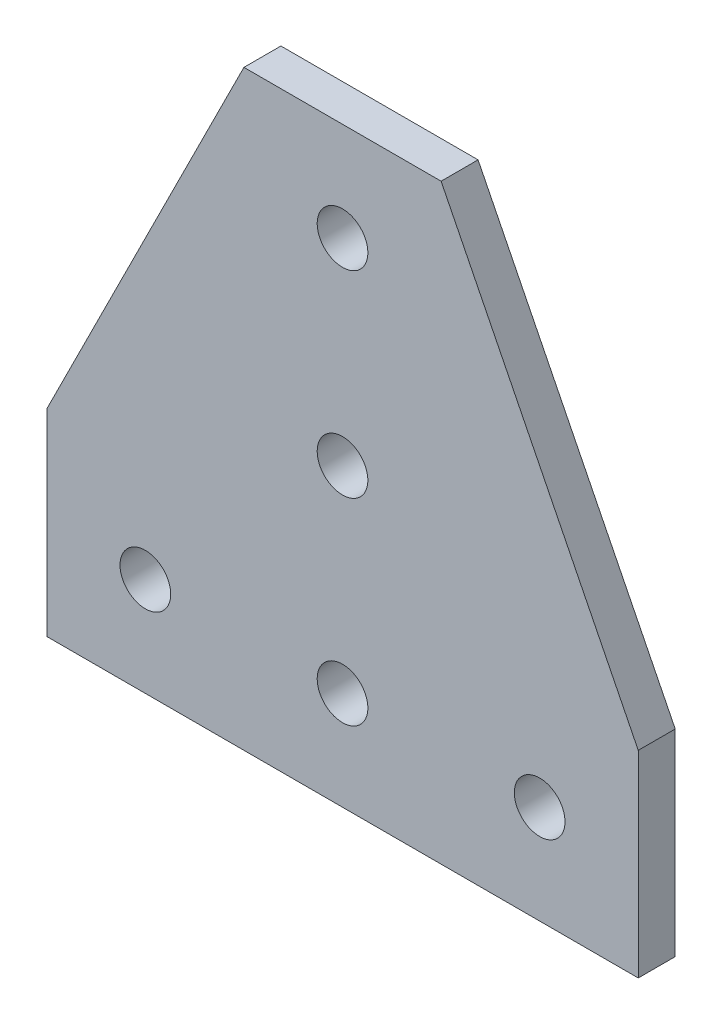
ISO-10303-21;
HEADER;
FILE_DESCRIPTION(('STEP AP214'),'2;1');
FILE_NAME('part.step','',(''),(''),'','','');
FILE_SCHEMA(('AUTOMOTIVE_DESIGN { 1 0 10303 214 1 1 1 1 }'));
ENDSEC;
DATA;
#1=APPLICATION_CONTEXT('core data for automotive mechanical design processes');
#2=APPLICATION_PROTOCOL_DEFINITION('international standard','automotive_design',2000,#1);
#3=PRODUCT_CONTEXT('',#1,'mechanical');
#4=PRODUCT('Part','Part','',(#3));
#5=PRODUCT_RELATED_PRODUCT_CATEGORY('part','',(#4));
#6=PRODUCT_DEFINITION_FORMATION('','',#4);
#7=PRODUCT_DEFINITION_CONTEXT('part definition',#1,'design');
#8=PRODUCT_DEFINITION('design','',#6,#7);
#9=PRODUCT_DEFINITION_SHAPE('','',#8);
#10=(LENGTH_UNIT() NAMED_UNIT(*) SI_UNIT(.MILLI.,.METRE.));
#11=(NAMED_UNIT(*) PLANE_ANGLE_UNIT() SI_UNIT($,.RADIAN.));
#12=(NAMED_UNIT(*) SI_UNIT($,.STERADIAN.) SOLID_ANGLE_UNIT());
#13=UNCERTAINTY_MEASURE_WITH_UNIT(LENGTH_MEASURE(1.E-05),#10,'distance_accuracy_value','');
#14=(GEOMETRIC_REPRESENTATION_CONTEXT(3) GLOBAL_UNCERTAINTY_ASSIGNED_CONTEXT((#13)) GLOBAL_UNIT_ASSIGNED_CONTEXT((#10,
#11,#12)) REPRESENTATION_CONTEXT('',''));
#15=CARTESIAN_POINT('',(0.,0.,0.));
#16=DIRECTION('',(0.,0.,1.));
#17=DIRECTION('',(1.,0.,0.));
#18=AXIS2_PLACEMENT_3D('',#15,#16,#17);
#19=CARTESIAN_POINT('',(-12.6999999999999,-25.4,-4.7625));
#20=DIRECTION('',(-0.894427190999916,0.447213595499959,0.));
#21=DIRECTION('',(-0.447213595499958,-0.894427190999918,0.));
#22=AXIS2_PLACEMENT_3D('',#19,#20,#21);
#23=PLANE('',#22);
#24=DIRECTION('',(-0.447213595499958,-0.894427190999918,0.));
#25=VECTOR('',#24,1.);
#26=CARTESIAN_POINT('',(-12.6999999999999,-25.4,0.));
#27=LINE('',#26,#25);
#28=CARTESIAN_POINT('',(12.7,25.4,0.));
#29=VERTEX_POINT('',#28);
#30=CARTESIAN_POINT('',(-12.6999999999999,-25.4,0.));
#31=VERTEX_POINT('',#30);
#32=EDGE_CURVE('E130',#29,#31,#27,.T.);
#33=ORIENTED_EDGE('',*,*,#32,.F.);
#34=DIRECTION('',(0.,0.,1.));
#35=VECTOR('',#34,1.);
#36=CARTESIAN_POINT('',(12.7,25.4,-4.7625));
#37=LINE('',#36,#35);
#38=CARTESIAN_POINT('',(12.7,25.4,-4.7625));
#39=VERTEX_POINT('',#38);
#40=EDGE_CURVE('E11',#39,#29,#37,.T.);
#41=ORIENTED_EDGE('',*,*,#40,.F.);
#42=DIRECTION('',(-0.447213595499958,-0.894427190999918,0.));
#43=VECTOR('',#42,1.);
#44=CARTESIAN_POINT('',(-12.6999999999999,-25.4,-4.7625));
#45=LINE('',#44,#43);
#46=CARTESIAN_POINT('',(-12.6999999999999,-25.4,-4.7625));
#47=VERTEX_POINT('',#46);
#48=EDGE_CURVE('E122',#39,#47,#45,.T.);
#49=ORIENTED_EDGE('',*,*,#48,.T.);
#50=DIRECTION('',(0.,0.,1.));
#51=VECTOR('',#50,1.);
#52=CARTESIAN_POINT('',(-12.6999999999999,-25.4,-4.7625));
#53=LINE('',#52,#51);
#54=EDGE_CURVE('E39',#47,#31,#53,.T.);
#55=ORIENTED_EDGE('',*,*,#54,.T.);
#56=EDGE_LOOP('',(#33,#41,#49,#55));
#57=FACE_BOUND('',#56,.T.);
#58=ADVANCED_FACE('F36',(#57),#23,.T.);
#59=CARTESIAN_POINT('',(12.7,25.4,-4.7625));
#60=DIRECTION('',(0.,1.,0.));
#61=DIRECTION('',(0.,0.,1.));
#62=AXIS2_PLACEMENT_3D('',#59,#60,#61);
#63=PLANE('',#62);
#64=DIRECTION('',(-1.,0.,0.));
#65=VECTOR('',#64,1.);
#66=CARTESIAN_POINT('',(12.7,25.4,0.));
#67=LINE('',#66,#65);
#68=CARTESIAN_POINT('',(38.1000000000001,25.4,0.));
#69=VERTEX_POINT('',#68);
#70=EDGE_CURVE('E125',#69,#29,#67,.T.);
#71=ORIENTED_EDGE('',*,*,#70,.F.);
#72=DIRECTION('',(0.,0.,1.));
#73=VECTOR('',#72,1.);
#74=CARTESIAN_POINT('',(38.1000000000001,25.4,-4.7625));
#75=LINE('',#74,#73);
#76=CARTESIAN_POINT('',(38.1000000000001,25.4,-4.7625));
#77=VERTEX_POINT('',#76);
#78=EDGE_CURVE('E118',#77,#69,#75,.T.);
#79=ORIENTED_EDGE('',*,*,#78,.F.);
#80=DIRECTION('',(-1.,0.,0.));
#81=VECTOR('',#80,1.);
#82=CARTESIAN_POINT('',(12.7,25.4,-4.7625));
#83=LINE('',#82,#81);
#84=EDGE_CURVE('E108',#77,#39,#83,.T.);
#85=ORIENTED_EDGE('',*,*,#84,.T.);
#86=ORIENTED_EDGE('',*,*,#40,.T.);
#87=EDGE_LOOP('',(#71,#79,#85,#86));
#88=FACE_BOUND('',#87,.T.);
#89=ADVANCED_FACE('F142',(#88),#63,.T.);
#90=CARTESIAN_POINT('',(25.4,-50.8000000000001,-4.7625));
#91=DIRECTION('',(0.,-1.,0.));
#92=DIRECTION('',(1.,0.,0.));
#93=AXIS2_PLACEMENT_3D('',#90,#91,#92);
#94=PLANE('',#93);
#95=DIRECTION('',(1.,0.,0.));
#96=VECTOR('',#95,1.);
#97=CARTESIAN_POINT('',(25.4,-50.8000000000001,0.));
#98=LINE('',#97,#96);
#99=CARTESIAN_POINT('',(-12.7,-50.8000000000001,0.));
#100=VERTEX_POINT('',#99);
#101=CARTESIAN_POINT('',(63.5,-50.8000000000001,0.));
#102=VERTEX_POINT('',#101);
#103=EDGE_CURVE('E136',#100,#102,#98,.T.);
#104=ORIENTED_EDGE('',*,*,#103,.F.);
#105=DIRECTION('',(0.,0.,1.));
#106=VECTOR('',#105,1.);
#107=CARTESIAN_POINT('',(-12.7,-50.8000000000001,-4.7625));
#108=LINE('',#107,#106);
#109=CARTESIAN_POINT('',(-12.7,-50.8000000000001,-4.7625));
#110=VERTEX_POINT('',#109);
#111=EDGE_CURVE('E45',#110,#100,#108,.T.);
#112=ORIENTED_EDGE('',*,*,#111,.F.);
#113=DIRECTION('',(1.,0.,0.));
#114=VECTOR('',#113,1.);
#115=CARTESIAN_POINT('',(25.4,-50.8000000000001,-4.7625));
#116=LINE('',#115,#114);
#117=CARTESIAN_POINT('',(63.5,-50.8000000000001,-4.7625));
#118=VERTEX_POINT('',#117);
#119=EDGE_CURVE('E127',#110,#118,#116,.T.);
#120=ORIENTED_EDGE('',*,*,#119,.T.);
#121=DIRECTION('',(0.,0.,1.));
#122=VECTOR('',#121,1.);
#123=CARTESIAN_POINT('',(63.5,-50.8000000000001,-4.7625));
#124=LINE('',#123,#122);
#125=EDGE_CURVE('E101',#118,#102,#124,.T.);
#126=ORIENTED_EDGE('',*,*,#125,.T.);
#127=EDGE_LOOP('',(#104,#112,#120,#126));
#128=FACE_BOUND('',#127,.T.);
#129=ADVANCED_FACE('F215',(#128),#94,.T.);
#130=CARTESIAN_POINT('',(-12.7,-50.8000000000001,-4.7625));
#131=DIRECTION('',(-1.,0.,0.));
#132=DIRECTION('',(0.,0.,1.));
#133=AXIS2_PLACEMENT_3D('',#130,#131,#132);
#134=PLANE('',#133);
#135=DIRECTION('',(0.,-1.,0.));
#136=VECTOR('',#135,1.);
#137=CARTESIAN_POINT('',(-12.7,-50.8000000000001,0.));
#138=LINE('',#137,#136);
#139=EDGE_CURVE('E133',#31,#100,#138,.T.);
#140=ORIENTED_EDGE('',*,*,#139,.F.);
#141=ORIENTED_EDGE('',*,*,#54,.F.);
#142=DIRECTION('',(0.,-1.,0.));
#143=VECTOR('',#142,1.);
#144=CARTESIAN_POINT('',(-12.7,-50.8000000000001,-4.7625));
#145=LINE('',#144,#143);
#146=EDGE_CURVE('E124',#47,#110,#145,.T.);
#147=ORIENTED_EDGE('',*,*,#146,.T.);
#148=ORIENTED_EDGE('',*,*,#111,.T.);
#149=EDGE_LOOP('',(#140,#141,#147,#148));
#150=FACE_BOUND('',#149,.T.);
#151=ADVANCED_FACE('F139',(#150),#134,.T.);
#152=CARTESIAN_POINT('',(12.7,25.4,-4.7625));
#153=DIRECTION('',(0.,0.,-1.));
#154=DIRECTION('',(-1.,0.,0.));
#155=AXIS2_PLACEMENT_3D('',#152,#153,#154);
#156=PLANE('',#155);
#157=CARTESIAN_POINT('',(0.,-38.1,-4.7625));
#158=DIRECTION('',(0.,0.,-1.));
#159=DIRECTION('',(-1.,0.,0.));
#160=AXIS2_PLACEMENT_3D('',#157,#158,#159);
#161=CIRCLE('',#160,3.2639);
#162=CARTESIAN_POINT('',(-3.2639,-38.1,-4.7625));
#163=VERTEX_POINT('',#162);
#164=EDGE_CURVE('E171',#163,#163,#161,.T.);
#165=ORIENTED_EDGE('',*,*,#164,.F.);
#166=EDGE_LOOP('',(#165));
#167=FACE_BOUND('',#166,.T.);
#168=CARTESIAN_POINT('',(50.8000000000001,-38.1,-4.7625));
#169=DIRECTION('',(0.,0.,-1.));
#170=DIRECTION('',(-1.,0.,0.));
#171=AXIS2_PLACEMENT_3D('',#168,#169,#170);
#172=CIRCLE('',#171,3.2639);
#173=CARTESIAN_POINT('',(47.5361000000001,-38.1,-4.7625));
#174=VERTEX_POINT('',#173);
#175=EDGE_CURVE('E165',#174,#174,#172,.T.);
#176=ORIENTED_EDGE('',*,*,#175,.F.);
#177=EDGE_LOOP('',(#176));
#178=FACE_BOUND('',#177,.T.);
#179=CARTESIAN_POINT('',(25.4000000000001,12.6999999999999,-4.7625));
#180=DIRECTION('',(0.,0.,-1.));
#181=DIRECTION('',(-1.,0.,0.));
#182=AXIS2_PLACEMENT_3D('',#179,#180,#181);
#183=CIRCLE('',#182,3.2639);
#184=CARTESIAN_POINT('',(22.1361000000001,12.6999999999999,-4.7625));
#185=VERTEX_POINT('',#184);
#186=EDGE_CURVE('E159',#185,#185,#183,.T.);
#187=ORIENTED_EDGE('',*,*,#186,.F.);
#188=EDGE_LOOP('',(#187));
#189=FACE_BOUND('',#188,.T.);
#190=CARTESIAN_POINT('',(25.4,-12.7,-4.7625));
#191=DIRECTION('',(0.,0.,-1.));
#192=DIRECTION('',(-1.,0.,0.));
#193=AXIS2_PLACEMENT_3D('',#190,#191,#192);
#194=CIRCLE('',#193,3.2639);
#195=CARTESIAN_POINT('',(22.1361,-12.7,-4.7625));
#196=VERTEX_POINT('',#195);
#197=EDGE_CURVE('E153',#196,#196,#194,.T.);
#198=ORIENTED_EDGE('',*,*,#197,.F.);
#199=EDGE_LOOP('',(#198));
#200=FACE_BOUND('',#199,.T.);
#201=CARTESIAN_POINT('',(25.4,-38.1,-4.7625));
#202=DIRECTION('',(0.,0.,-1.));
#203=DIRECTION('',(-1.,0.,0.));
#204=AXIS2_PLACEMENT_3D('',#201,#202,#203);
#205=CIRCLE('',#204,3.2639);
#206=CARTESIAN_POINT('',(22.1361,-38.1,-4.7625));
#207=VERTEX_POINT('',#206);
#208=EDGE_CURVE('E147',#207,#207,#205,.T.);
#209=ORIENTED_EDGE('',*,*,#208,.F.);
#210=EDGE_LOOP('',(#209));
#211=FACE_BOUND('',#210,.T.);
#212=ORIENTED_EDGE('',*,*,#48,.F.);
#213=ORIENTED_EDGE('',*,*,#84,.F.);
#214=DIRECTION('',(0.447213595499958,-0.894427190999918,0.));
#215=VECTOR('',#214,1.);
#216=CARTESIAN_POINT('',(63.5,-25.4000000000001,-4.7625));
#217=LINE('',#216,#215);
#218=CARTESIAN_POINT('',(63.5,-25.4000000000001,-4.7625));
#219=VERTEX_POINT('',#218);
#220=EDGE_CURVE('E104',#77,#219,#217,.T.);
#221=ORIENTED_EDGE('',*,*,#220,.T.);
#222=DIRECTION('',(0.,-1.,0.));
#223=VECTOR('',#222,1.);
#224=CARTESIAN_POINT('',(63.5,-50.8000000000001,-4.7625));
#225=LINE('',#224,#223);
#226=EDGE_CURVE('E93',#219,#118,#225,.T.);
#227=ORIENTED_EDGE('',*,*,#226,.T.);
#228=ORIENTED_EDGE('',*,*,#119,.F.);
#229=ORIENTED_EDGE('',*,*,#146,.F.);
#230=EDGE_LOOP('',(#212,#213,#221,#227,#228,#229));
#231=FACE_BOUND('',#230,.T.);
#232=ADVANCED_FACE('F107',(#167,#178,#189,#200,#211,#231),#156,.T.);
#233=CARTESIAN_POINT('',(12.7,25.4,0.));
#234=DIRECTION('',(0.,0.,-1.));
#235=DIRECTION('',(-1.,0.,0.));
#236=AXIS2_PLACEMENT_3D('',#233,#234,#235);
#237=PLANE('',#236);
#238=CARTESIAN_POINT('',(0.,-38.1,0.));
#239=DIRECTION('',(0.,0.,-1.));
#240=DIRECTION('',(-1.,0.,0.));
#241=AXIS2_PLACEMENT_3D('',#238,#239,#240);
#242=CIRCLE('',#241,3.2639);
#243=CARTESIAN_POINT('',(-3.2639,-38.1,0.));
#244=VERTEX_POINT('',#243);
#245=EDGE_CURVE('E168',#244,#244,#242,.T.);
#246=ORIENTED_EDGE('',*,*,#245,.T.);
#247=EDGE_LOOP('',(#246));
#248=FACE_BOUND('',#247,.T.);
#249=CARTESIAN_POINT('',(50.8000000000001,-38.1,0.));
#250=DIRECTION('',(0.,0.,-1.));
#251=DIRECTION('',(-1.,0.,0.));
#252=AXIS2_PLACEMENT_3D('',#249,#250,#251);
#253=CIRCLE('',#252,3.2639);
#254=CARTESIAN_POINT('',(47.5361000000001,-38.1,0.));
#255=VERTEX_POINT('',#254);
#256=EDGE_CURVE('E162',#255,#255,#253,.T.);
#257=ORIENTED_EDGE('',*,*,#256,.T.);
#258=EDGE_LOOP('',(#257));
#259=FACE_BOUND('',#258,.T.);
#260=CARTESIAN_POINT('',(25.4000000000001,12.6999999999999,0.));
#261=DIRECTION('',(0.,0.,-1.));
#262=DIRECTION('',(-1.,0.,0.));
#263=AXIS2_PLACEMENT_3D('',#260,#261,#262);
#264=CIRCLE('',#263,3.2639);
#265=CARTESIAN_POINT('',(22.1361000000001,12.6999999999999,0.));
#266=VERTEX_POINT('',#265);
#267=EDGE_CURVE('E156',#266,#266,#264,.T.);
#268=ORIENTED_EDGE('',*,*,#267,.T.);
#269=EDGE_LOOP('',(#268));
#270=FACE_BOUND('',#269,.T.);
#271=CARTESIAN_POINT('',(25.4,-12.7,0.));
#272=DIRECTION('',(0.,0.,-1.));
#273=DIRECTION('',(-1.,0.,0.));
#274=AXIS2_PLACEMENT_3D('',#271,#272,#273);
#275=CIRCLE('',#274,3.2639);
#276=CARTESIAN_POINT('',(22.1361,-12.7,0.));
#277=VERTEX_POINT('',#276);
#278=EDGE_CURVE('E150',#277,#277,#275,.T.);
#279=ORIENTED_EDGE('',*,*,#278,.T.);
#280=EDGE_LOOP('',(#279));
#281=FACE_BOUND('',#280,.T.);
#282=CARTESIAN_POINT('',(25.4,-38.1,0.));
#283=DIRECTION('',(0.,0.,-1.));
#284=DIRECTION('',(-1.,0.,0.));
#285=AXIS2_PLACEMENT_3D('',#282,#283,#284);
#286=CIRCLE('',#285,3.2639);
#287=CARTESIAN_POINT('',(22.1361,-38.1,0.));
#288=VERTEX_POINT('',#287);
#289=EDGE_CURVE('E145',#288,#288,#286,.T.);
#290=ORIENTED_EDGE('',*,*,#289,.T.);
#291=EDGE_LOOP('',(#290));
#292=FACE_BOUND('',#291,.T.);
#293=ORIENTED_EDGE('',*,*,#32,.T.);
#294=ORIENTED_EDGE('',*,*,#139,.T.);
#295=ORIENTED_EDGE('',*,*,#103,.T.);
#296=DIRECTION('',(0.,-1.,0.));
#297=VECTOR('',#296,1.);
#298=CARTESIAN_POINT('',(63.5,-50.8000000000001,0.));
#299=LINE('',#298,#297);
#300=CARTESIAN_POINT('',(63.5,-25.4000000000001,0.));
#301=VERTEX_POINT('',#300);
#302=EDGE_CURVE('E112',#301,#102,#299,.T.);
#303=ORIENTED_EDGE('',*,*,#302,.F.);
#304=DIRECTION('',(0.447213595499958,-0.894427190999918,0.));
#305=VECTOR('',#304,1.);
#306=CARTESIAN_POINT('',(63.5,-25.4000000000001,0.));
#307=LINE('',#306,#305);
#308=EDGE_CURVE('E116',#69,#301,#307,.T.);
#309=ORIENTED_EDGE('',*,*,#308,.F.);
#310=ORIENTED_EDGE('',*,*,#70,.T.);
#311=EDGE_LOOP('',(#293,#294,#295,#303,#309,#310));
#312=FACE_BOUND('',#311,.T.);
#313=ADVANCED_FACE('F141',(#248,#259,#270,#281,#292,#312),#237,.F.);
#314=CARTESIAN_POINT('',(63.5,-25.4000000000001,-4.7625));
#315=DIRECTION('',(0.894427190999916,0.447213595499959,0.));
#316=DIRECTION('',(0.447213595499958,-0.894427190999918,0.));
#317=AXIS2_PLACEMENT_3D('',#314,#315,#316);
#318=PLANE('',#317);
#319=ORIENTED_EDGE('',*,*,#308,.T.);
#320=DIRECTION('',(0.,0.,1.));
#321=VECTOR('',#320,1.);
#322=CARTESIAN_POINT('',(63.5,-25.4000000000001,-4.7625));
#323=LINE('',#322,#321);
#324=EDGE_CURVE('E98',#219,#301,#323,.T.);
#325=ORIENTED_EDGE('',*,*,#324,.F.);
#326=ORIENTED_EDGE('',*,*,#220,.F.);
#327=ORIENTED_EDGE('',*,*,#78,.T.);
#328=EDGE_LOOP('',(#319,#325,#326,#327));
#329=FACE_BOUND('',#328,.T.);
#330=ADVANCED_FACE('F114',(#329),#318,.T.);
#331=CARTESIAN_POINT('',(63.5,-50.8000000000001,-4.7625));
#332=DIRECTION('',(1.,0.,0.));
#333=DIRECTION('',(0.,0.,1.));
#334=AXIS2_PLACEMENT_3D('',#331,#332,#333);
#335=PLANE('',#334);
#336=ORIENTED_EDGE('',*,*,#302,.T.);
#337=ORIENTED_EDGE('',*,*,#125,.F.);
#338=ORIENTED_EDGE('',*,*,#226,.F.);
#339=ORIENTED_EDGE('',*,*,#324,.T.);
#340=EDGE_LOOP('',(#336,#337,#338,#339));
#341=FACE_BOUND('',#340,.T.);
#342=ADVANCED_FACE('F96',(#341),#335,.T.);
#343=CARTESIAN_POINT('',(25.4,-38.1,0.));
#344=DIRECTION('',(0.,0.,-1.));
#345=DIRECTION('',(-1.,0.,0.));
#346=AXIS2_PLACEMENT_3D('',#343,#344,#345);
#347=CYLINDRICAL_SURFACE('',#346,3.2639);
#348=ORIENTED_EDGE('',*,*,#289,.F.);
#349=EDGE_LOOP('',(#348));
#350=FACE_BOUND('',#349,.T.);
#351=ORIENTED_EDGE('',*,*,#208,.T.);
#352=EDGE_LOOP('',(#351));
#353=FACE_BOUND('',#352,.T.);
#354=ADVANCED_FACE('F197',(#350,#353),#347,.F.);
#355=CARTESIAN_POINT('',(25.4,-12.7,0.));
#356=DIRECTION('',(0.,0.,-1.));
#357=DIRECTION('',(-1.,0.,0.));
#358=AXIS2_PLACEMENT_3D('',#355,#356,#357);
#359=CYLINDRICAL_SURFACE('',#358,3.2639);
#360=ORIENTED_EDGE('',*,*,#278,.F.);
#361=EDGE_LOOP('',(#360));
#362=FACE_BOUND('',#361,.T.);
#363=ORIENTED_EDGE('',*,*,#197,.T.);
#364=EDGE_LOOP('',(#363));
#365=FACE_BOUND('',#364,.T.);
#366=ADVANCED_FACE('F199',(#362,#365),#359,.F.);
#367=CARTESIAN_POINT('',(25.4000000000001,12.6999999999999,0.));
#368=DIRECTION('',(0.,0.,-1.));
#369=DIRECTION('',(-1.,0.,0.));
#370=AXIS2_PLACEMENT_3D('',#367,#368,#369);
#371=CYLINDRICAL_SURFACE('',#370,3.2639);
#372=ORIENTED_EDGE('',*,*,#267,.F.);
#373=EDGE_LOOP('',(#372));
#374=FACE_BOUND('',#373,.T.);
#375=ORIENTED_EDGE('',*,*,#186,.T.);
#376=EDGE_LOOP('',(#375));
#377=FACE_BOUND('',#376,.T.);
#378=ADVANCED_FACE('F206',(#374,#377),#371,.F.);
#379=CARTESIAN_POINT('',(50.8000000000001,-38.1,0.));
#380=DIRECTION('',(0.,0.,-1.));
#381=DIRECTION('',(-1.,0.,0.));
#382=AXIS2_PLACEMENT_3D('',#379,#380,#381);
#383=CYLINDRICAL_SURFACE('',#382,3.2639);
#384=ORIENTED_EDGE('',*,*,#256,.F.);
#385=EDGE_LOOP('',(#384));
#386=FACE_BOUND('',#385,.T.);
#387=ORIENTED_EDGE('',*,*,#175,.T.);
#388=EDGE_LOOP('',(#387));
#389=FACE_BOUND('',#388,.T.);
#390=ADVANCED_FACE('F182',(#386,#389),#383,.F.);
#391=CARTESIAN_POINT('',(0.,-38.1,0.));
#392=DIRECTION('',(0.,0.,-1.));
#393=DIRECTION('',(-1.,0.,0.));
#394=AXIS2_PLACEMENT_3D('',#391,#392,#393);
#395=CYLINDRICAL_SURFACE('',#394,3.2639);
#396=ORIENTED_EDGE('',*,*,#245,.F.);
#397=EDGE_LOOP('',(#396));
#398=FACE_BOUND('',#397,.T.);
#399=ORIENTED_EDGE('',*,*,#164,.T.);
#400=EDGE_LOOP('',(#399));
#401=FACE_BOUND('',#400,.T.);
#402=ADVANCED_FACE('F179',(#398,#401),#395,.F.);
#403=CLOSED_SHELL('',(#58,#89,#129,#151,#232,#313,#330,#342,#354,#366,#378,#390,#402));
#404=MANIFOLD_SOLID_BREP('B2',#403);
#405=ADVANCED_BREP_SHAPE_REPRESENTATION('',(#18,#404),#14);
#406=SHAPE_DEFINITION_REPRESENTATION(#9,#405);
ENDSEC;
END-ISO-10303-21;
